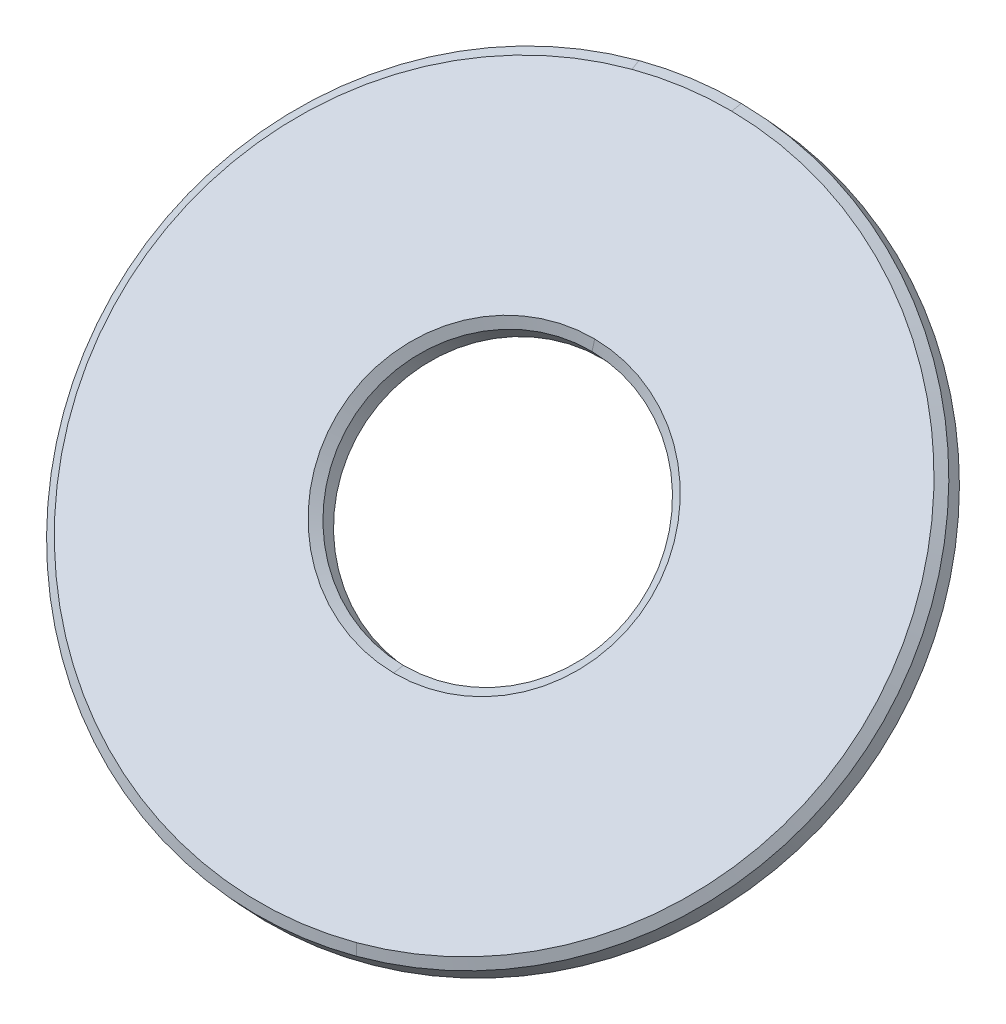
ISO-10303-21;
HEADER;
FILE_DESCRIPTION(('STEP AP214'),'2;1');
FILE_NAME('part.step','',(''),(''),'','','');
FILE_SCHEMA(('AUTOMOTIVE_DESIGN { 1 0 10303 214 1 1 1 1 }'));
ENDSEC;
DATA;
#1=APPLICATION_CONTEXT('core data for automotive mechanical design processes');
#2=APPLICATION_PROTOCOL_DEFINITION('international standard','automotive_design',2000,#1);
#3=PRODUCT_CONTEXT('',#1,'mechanical');
#4=PRODUCT('Part','Part','',(#3));
#5=PRODUCT_RELATED_PRODUCT_CATEGORY('part','',(#4));
#6=PRODUCT_DEFINITION_FORMATION('','',#4);
#7=PRODUCT_DEFINITION_CONTEXT('part definition',#1,'design');
#8=PRODUCT_DEFINITION('design','',#6,#7);
#9=PRODUCT_DEFINITION_SHAPE('','',#8);
#10=(LENGTH_UNIT() NAMED_UNIT(*) SI_UNIT(.MILLI.,.METRE.));
#11=(NAMED_UNIT(*) PLANE_ANGLE_UNIT() SI_UNIT($,.RADIAN.));
#12=(NAMED_UNIT(*) SI_UNIT($,.STERADIAN.) SOLID_ANGLE_UNIT());
#13=UNCERTAINTY_MEASURE_WITH_UNIT(LENGTH_MEASURE(1.E-05),#10,'distance_accuracy_value','');
#14=(GEOMETRIC_REPRESENTATION_CONTEXT(3) GLOBAL_UNCERTAINTY_ASSIGNED_CONTEXT((#13)) GLOBAL_UNIT_ASSIGNED_CONTEXT((#10,
#11,#12)) REPRESENTATION_CONTEXT('',''));
#15=CARTESIAN_POINT('',(0.,0.,0.));
#16=DIRECTION('',(0.,0.,1.));
#17=DIRECTION('',(1.,0.,0.));
#18=AXIS2_PLACEMENT_3D('',#15,#16,#17);
#19=CARTESIAN_POINT('',(-32.0413030325885,39.8953625177244,29.7265539162494));
#20=DIRECTION('',(0.241844762647997,0.707106781186508,0.664463024388709));
#21=DIRECTION('',(0.,-0.684791078771776,0.728739444818646));
#22=AXIS2_PLACEMENT_3D('',#19,#20,#21);
#23=CONICAL_SURFACE('',#22,1.64999999990241,0.785398163680828);
#24=CARTESIAN_POINT('',(-32.0654875088166,39.824651839713,29.6601076139113));
#25=DIRECTION('',(0.241844762648,0.707106781186508,0.664463024388708));
#26=DIRECTION('',(-0.970314954424455,0.176241818055159,0.165613135918863));
#27=AXIS2_PLACEMENT_3D('',#24,#25,#26);
#28=CIRCLE('',#27,1.55000000000785);
#29=CARTESIAN_POINT('',(-32.0654875088268,40.8860780118111,28.5305614744443));
#30=VERTEX_POINT('',#29);
#31=CARTESIAN_POINT('',(-32.0654875088268,38.7632256676185,30.789653753382));
#32=VERTEX_POINT('',#31);
#33=EDGE_CURVE('E41',#30,#32,#28,.T.);
#34=ORIENTED_EDGE('',*,*,#33,.F.);
#35=DIRECTION('',(0.171010071614389,0.984220415491074,-0.0454502930355773));
#36=VECTOR('',#35,1.);
#37=CARTESIAN_POINT('',(-32.0413030325885,41.025267797631,28.5241338323697));
#38=LINE('',#37,#36);
#39=CARTESIAN_POINT('',(-32.0413030325771,41.0252677976965,28.5241338323667));
#40=VERTEX_POINT('',#39);
#41=EDGE_CURVE('E11',#30,#40,#38,.T.);
#42=ORIENTED_EDGE('',*,*,#41,.T.);
#43=CARTESIAN_POINT('',(-32.0413030325771,39.8953625177577,29.7265539162806));
#44=DIRECTION('',(0.241844762647997,0.707106781186509,0.664463024388708));
#45=DIRECTION('',(0.,-0.684791078771774,0.728739444818647));
#46=AXIS2_PLACEMENT_3D('',#43,#44,#45);
#47=CIRCLE('',#46,1.64999999994945);
#48=CARTESIAN_POINT('',(-32.0413030325771,38.7654572378188,30.9289740001946));
#49=VERTEX_POINT('',#48);
#50=EDGE_CURVE('E27',#40,#49,#47,.T.);
#51=ORIENTED_EDGE('',*,*,#50,.T.);
#52=DIRECTION('',(0.171010071614389,0.0157795842254914,0.985142913555243));
#53=VECTOR('',#52,1.);
#54=CARTESIAN_POINT('',(-32.0413030325885,38.7654572378177,30.928974000129));
#55=LINE('',#54,#53);
#56=EDGE_CURVE('E184',#32,#49,#55,.T.);
#57=ORIENTED_EDGE('',*,*,#56,.F.);
#58=EDGE_LOOP('',(#34,#42,#51,#57));
#59=FACE_BOUND('',#58,.T.);
#60=ADVANCED_FACE('F16',(#59),#23,.F.);
#61=CARTESIAN_POINT('',(-32.065487508824,39.824651839706,29.6601076138962));
#62=DIRECTION('',(-0.241844762648002,-0.707106781186508,-0.664463024388707));
#63=DIRECTION('',(0.,0.684791078771774,-0.728739444818647));
#64=AXIS2_PLACEMENT_3D('',#61,#62,#63);
#65=CONICAL_SURFACE('',#64,3.999999999954,0.785398163348843);
#66=CARTESIAN_POINT('',(-32.0413030325854,39.8953625177482,29.7265539162631));
#67=DIRECTION('',(-0.241844762648002,-0.707106781186508,-0.664463024388707));
#68=DIRECTION('',(0.,0.684791078771774,-0.728739444818647));
#69=AXIS2_PLACEMENT_3D('',#66,#67,#68);
#70=CIRCLE('',#69,3.90000000007195);
#71=CARTESIAN_POINT('',(-32.9844976069057,42.6530789644455,27.1351481211396));
#72=VERTEX_POINT('',#71);
#73=CARTESIAN_POINT('',(-32.0413030325854,42.5660477250074,26.884470081418));
#74=VERTEX_POINT('',#73);
#75=EDGE_CURVE('E174',#72,#74,#70,.T.);
#76=ORIENTED_EDGE('',*,*,#75,.T.);
#77=DIRECTION('',(-0.171010071671165,-0.0157795845522379,-0.985142913540153));
#78=VECTOR('',#77,1.);
#79=CARTESIAN_POINT('',(-32.065487508824,42.5638161547616,26.7451498346551));
#80=LINE('',#79,#78);
#81=CARTESIAN_POINT('',(-32.0654875088268,42.5638161547936,26.7451498346221));
#82=VERTEX_POINT('',#81);
#83=EDGE_CURVE('E129',#74,#82,#80,.T.);
#84=ORIENTED_EDGE('',*,*,#83,.T.);
#85=CARTESIAN_POINT('',(-32.065487508824,39.824651839706,29.6601076138962));
#86=DIRECTION('',(0.241844762648003,0.707106781186508,0.664463024388707));
#87=DIRECTION('',(-0.970314954424454,0.176241818066685,0.165613135906601));
#88=AXIS2_PLACEMENT_3D('',#85,#86,#87);
#89=CIRCLE('',#88,3.999999999954);
#90=CARTESIAN_POINT('',(-33.0328665594211,42.6530789644179,27.0022555162742));
#91=VERTEX_POINT('',#90);
#92=EDGE_CURVE('E253',#82,#91,#89,.T.);
#93=ORIENTED_EDGE('',*,*,#92,.T.);
#94=DIRECTION('',(-0.342020143328698,0.,-0.939692620784806));
#95=VECTOR('',#94,1.);
#96=CARTESIAN_POINT('',(-199135.249068371,42.6530789106248,-547001.840916849));
#97=LINE('',#96,#95);
#98=EDGE_CURVE('E212',#72,#91,#97,.T.);
#99=ORIENTED_EDGE('',*,*,#98,.F.);
#100=EDGE_LOOP('',(#76,#84,#93,#99));
#101=FACE_BOUND('',#100,.T.);
#102=ADVANCED_FACE('F371',(#101),#65,.T.);
#103=CARTESIAN_POINT('',(-32.04130303257,39.89536251781,29.72655391633));
#104=DIRECTION('',(0.241844762648003,0.707106781186508,0.664463024388707));
#105=DIRECTION('',(0.,-0.684791078771775,0.728739444818647));
#106=AXIS2_PLACEMENT_3D('',#103,#104,#105);
#107=CYLINDRICAL_SURFACE('',#106,1.55);
#108=CARTESIAN_POINT('',(-32.1380409376286,39.6125198053373,29.4607687065764));
#109=DIRECTION('',(0.241844762648003,0.707106781186508,0.664463024388707));
#110=DIRECTION('',(0.,-0.684791078771775,0.728739444818647));
#111=AXIS2_PLACEMENT_3D('',#108,#109,#110);
#112=CIRCLE('',#111,1.55);
#113=CARTESIAN_POINT('',(-32.1380409376235,40.6739459774793,28.331222567057));
#114=VERTEX_POINT('',#113);
#115=CARTESIAN_POINT('',(-32.1380409376235,38.5510936331927,30.590314846095));
#116=VERTEX_POINT('',#115);
#117=EDGE_CURVE('E156',#114,#116,#112,.T.);
#118=ORIENTED_EDGE('',*,*,#117,.F.);
#119=DIRECTION('',(0.241844762648003,0.707106781186508,0.664463024388707));
#120=VECTOR('',#119,1.);
#121=CARTESIAN_POINT('',(-32.04130303257,40.9567886899063,28.5970077768611));
#122=LINE('',#121,#120);
#123=EDGE_CURVE('E492',#114,#30,#122,.T.);
#124=ORIENTED_EDGE('',*,*,#123,.T.);
#125=ORIENTED_EDGE('',*,*,#33,.T.);
#126=DIRECTION('',(0.241844762648003,0.707106781186508,0.664463024388707));
#127=VECTOR('',#126,1.);
#128=CARTESIAN_POINT('',(-32.04130303257,38.8339363457138,30.8561000557989));
#129=LINE('',#128,#127);
#130=EDGE_CURVE('E229',#116,#32,#129,.T.);
#131=ORIENTED_EDGE('',*,*,#130,.F.);
#132=EDGE_LOOP('',(#118,#124,#125,#131));
#133=FACE_BOUND('',#132,.T.);
#134=ADVANCED_FACE('F323',(#133),#107,.F.);
#135=CARTESIAN_POINT('',(-32.16222541389,39.54180912722,29.39432240413));
#136=DIRECTION('',(-0.241844762648003,-0.707106781186508,-0.664463024388707));
#137=DIRECTION('',(0.,0.684791078771774,-0.728739444818647));
#138=AXIS2_PLACEMENT_3D('',#135,#136,#137);
#139=CYLINDRICAL_SURFACE('',#138,4.);
#140=CARTESIAN_POINT('',(-32.065487508824,39.824651839706,29.6601076138962));
#141=DIRECTION('',(0.241844762648003,0.707106781186508,0.664463024388707));
#142=DIRECTION('',(-0.970314954424455,0.17624181806668,0.165613135906607));
#143=AXIS2_PLACEMENT_3D('',#140,#141,#142);
#144=CIRCLE('',#143,3.999999999954);
#145=CARTESIAN_POINT('',(-32.0654875088268,37.0854875246194,32.5750653931712));
#146=VERTEX_POINT('',#145);
#147=CARTESIAN_POINT('',(-31.0981084582342,36.996224714992,32.3179597114164));
#148=VERTEX_POINT('',#147);
#149=EDGE_CURVE('E20',#146,#148,#144,.T.);
#150=ORIENTED_EDGE('',*,*,#149,.F.);
#151=DIRECTION('',(-0.241844762648003,-0.707106781186508,-0.664463024388707));
#152=VECTOR('',#151,1.);
#153=CARTESIAN_POINT('',(-32.16222541389,36.8026448121329,32.3092801834046));
#154=LINE('',#153,#152);
#155=CARTESIAN_POINT('',(-32.1380409376211,36.8733554902664,32.3757264858254));
#156=VERTEX_POINT('',#155);
#157=EDGE_CURVE('E197',#146,#156,#154,.T.);
#158=ORIENTED_EDGE('',*,*,#157,.T.);
#159=CARTESIAN_POINT('',(-32.1380409376253,39.6125198053384,29.4607687065686));
#160=DIRECTION('',(0.241844762648003,0.707106781186508,0.664463024388707));
#161=DIRECTION('',(-1.04430353253804E-12,0.684791078771963,-0.728739444818469));
#162=AXIS2_PLACEMENT_3D('',#159,#160,#161);
#163=CIRCLE('',#162,4.);
#164=CARTESIAN_POINT('',(-32.1380409376211,42.35168412041,26.545810927309));
#165=VERTEX_POINT('',#164);
#166=EDGE_CURVE('E193',#156,#165,#163,.T.);
#167=ORIENTED_EDGE('',*,*,#166,.T.);
#168=DIRECTION('',(-0.241844762648003,-0.707106781186508,-0.664463024388707));
#169=VECTOR('',#168,1.);
#170=CARTESIAN_POINT('',(-32.16222541389,42.2809734423071,26.4793646248554));
#171=LINE('',#170,#169);
#172=EDGE_CURVE('E88',#82,#165,#171,.T.);
#173=ORIENTED_EDGE('',*,*,#172,.F.);
#174=CARTESIAN_POINT('',(-32.065487508824,39.824651839706,29.6601076138962));
#175=DIRECTION('',(0.241844762648003,0.707106781186508,0.664463024388707));
#176=DIRECTION('',(-0.970314954424455,0.176241818066678,0.165613135906608));
#177=AXIS2_PLACEMENT_3D('',#174,#175,#176);
#178=CIRCLE('',#177,3.999999999954);
#179=EDGE_CURVE('E227',#148,#82,#178,.T.);
#180=ORIENTED_EDGE('',*,*,#179,.F.);
#181=EDGE_LOOP('',(#150,#158,#167,#173,#180));
#182=FACE_BOUND('',#181,.T.);
#183=ADVANCED_FACE('F196',(#182),#139,.T.);
#184=CARTESIAN_POINT('',(-32.162225413883,39.5418091272327,29.3943224041515));
#185=DIRECTION('',(-0.241844762647999,-0.707106781186511,-0.664463024388705));
#186=DIRECTION('',(0.,0.684791078771772,-0.728739444818649));
#187=AXIS2_PLACEMENT_3D('',#184,#185,#186);
#188=CONICAL_SURFACE('',#187,1.6500000000391,0.785398163357481);
#189=ORIENTED_EDGE('',*,*,#117,.T.);
#190=DIRECTION('',(-0.171010071669686,-0.984220415496176,0.0454502927170357));
#191=VECTOR('',#190,1.);
#192=CARTESIAN_POINT('',(-32.162225413883,38.4119038472325,30.5967424881308));
#193=LINE('',#192,#191);
#194=CARTESIAN_POINT('',(-32.162225413883,38.4119038472325,30.5967424881308));
#195=VERTEX_POINT('',#194);
#196=EDGE_CURVE('E153',#116,#195,#193,.T.);
#197=ORIENTED_EDGE('',*,*,#196,.T.);
#198=CARTESIAN_POINT('',(-32.162225413883,39.5418091272327,29.3943224041515));
#199=DIRECTION('',(0.241844762647999,0.707106781186509,0.664463024388708));
#200=DIRECTION('',(0.,0.684791078771774,-0.728739444818647));
#201=AXIS2_PLACEMENT_3D('',#198,#199,#200);
#202=CIRCLE('',#201,1.65000000003911);
#203=CARTESIAN_POINT('',(-32.162225413883,40.6717144072329,28.1919023201722));
#204=VERTEX_POINT('',#203);
#205=EDGE_CURVE('E141',#204,#195,#202,.T.);
#206=ORIENTED_EDGE('',*,*,#205,.F.);
#207=DIRECTION('',(-0.171010071669686,-0.0157795845437398,-0.985142913540546));
#208=VECTOR('',#207,1.);
#209=CARTESIAN_POINT('',(-32.162225413883,40.6717144072329,28.1919023201722));
#210=LINE('',#209,#208);
#211=EDGE_CURVE('E163',#114,#204,#210,.T.);
#212=ORIENTED_EDGE('',*,*,#211,.F.);
#213=EDGE_LOOP('',(#189,#197,#206,#212));
#214=FACE_BOUND('',#213,.T.);
#215=ADVANCED_FACE('F154',(#214),#188,.F.);
#216=CARTESIAN_POINT('',(-32.1380409376204,39.6125198053403,29.4607687065692));
#217=DIRECTION('',(0.241844762648004,0.707106781186508,0.664463024388707));
#218=DIRECTION('',(0.,-0.684791078771774,0.728739444818647));
#219=AXIS2_PLACEMENT_3D('',#216,#217,#218);
#220=CONICAL_SURFACE('',#219,3.99999999998053,0.78539816333635);
#221=CARTESIAN_POINT('',(-32.162225413892,39.5418091272017,29.3943224041115));
#222=DIRECTION('',(0.241844762648004,0.707106781186508,0.664463024388707));
#223=DIRECTION('',(0.,-0.684791078771774,0.728739444818647));
#224=AXIS2_PLACEMENT_3D('',#221,#222,#223);
#225=CIRCLE('',#224,3.89999999996456);
#226=CARTESIAN_POINT('',(-32.162225413892,36.871123920016,32.2364062388784));
#227=VERTEX_POINT('',#226);
#228=CARTESIAN_POINT('',(-32.162225413892,42.2124943343873,26.5522385693446));
#229=VERTEX_POINT('',#228);
#230=EDGE_CURVE('E161',#227,#229,#225,.T.);
#231=ORIENTED_EDGE('',*,*,#230,.T.);
#232=DIRECTION('',(0.171010071673303,0.984220415496509,-0.0454502926962175));
#233=VECTOR('',#232,1.);
#234=CARTESIAN_POINT('',(-32.1380409376204,42.3516841204141,26.5458109273088));
#235=LINE('',#234,#233);
#236=EDGE_CURVE('E179',#229,#165,#235,.T.);
#237=ORIENTED_EDGE('',*,*,#236,.T.);
#238=ORIENTED_EDGE('',*,*,#166,.F.);
#239=DIRECTION('',(0.171010071673303,0.015779584564533,0.985142913539585));
#240=VECTOR('',#239,1.);
#241=CARTESIAN_POINT('',(-32.1380409376204,36.8733554902666,32.3757264858296));
#242=LINE('',#241,#240);
#243=EDGE_CURVE('E75',#227,#156,#242,.T.);
#244=ORIENTED_EDGE('',*,*,#243,.F.);
#245=EDGE_LOOP('',(#231,#237,#238,#244));
#246=FACE_BOUND('',#245,.T.);
#247=ADVANCED_FACE('F192',(#246),#220,.T.);
#248=CARTESIAN_POINT('',(-32.04130303257,39.89536251781,29.72655391633));
#249=DIRECTION('',(-0.241844762648003,-0.707106781186508,-0.664463024388707));
#250=DIRECTION('',(0.,0.684791078771774,-0.728739444818647));
#251=AXIS2_PLACEMENT_3D('',#248,#249,#250);
#252=PLANE('',#251);
#253=ORIENTED_EDGE('',*,*,#75,.F.);
#254=CARTESIAN_POINT('',(-32.0413030325602,39.8953625178219,29.7265539163324));
#255=DIRECTION('',(-0.241844762648002,-0.707106781186508,-0.664463024388707));
#256=DIRECTION('',(0.,0.684791078771774,-0.728739444818647));
#257=AXIS2_PLACEMENT_3D('',#254,#255,#256);
#258=CIRCLE('',#257,3.89999999996766);
#259=CARTESIAN_POINT('',(-31.0981084582377,37.137646071204,32.3179597113994));
#260=VERTEX_POINT('',#259);
#261=EDGE_CURVE('E221',#260,#72,#258,.T.);
#262=ORIENTED_EDGE('',*,*,#261,.F.);
#263=CARTESIAN_POINT('',(-32.0413030325854,39.8953625177482,29.7265539162631));
#264=DIRECTION('',(-0.241844762648002,-0.707106781186508,-0.664463024388707));
#265=DIRECTION('',(0.,0.684791078771774,-0.728739444818647));
#266=AXIS2_PLACEMENT_3D('',#263,#264,#265);
#267=CIRCLE('',#266,3.90000000007195);
#268=EDGE_CURVE('E223',#74,#260,#267,.T.);
#269=ORIENTED_EDGE('',*,*,#268,.F.);
#270=EDGE_LOOP('',(#253,#262,#269));
#271=FACE_BOUND('',#270,.T.);
#272=CARTESIAN_POINT('',(-32.0413030325771,39.8953625177577,29.7265539162806));
#273=DIRECTION('',(0.241844762647997,0.707106781186509,0.664463024388708));
#274=DIRECTION('',(0.,-0.684791078771774,0.728739444818647));
#275=AXIS2_PLACEMENT_3D('',#272,#273,#274);
#276=CIRCLE('',#275,1.64999999994945);
#277=EDGE_CURVE('E172',#49,#40,#276,.T.);
#278=ORIENTED_EDGE('',*,*,#277,.F.);
#279=ORIENTED_EDGE('',*,*,#50,.F.);
#280=EDGE_LOOP('',(#278,#279));
#281=FACE_BOUND('',#280,.T.);
#282=ADVANCED_FACE('F331',(#271,#281),#252,.F.);
#283=CARTESIAN_POINT('',(-32.0413030325885,39.8953625177244,29.7265539162494));
#284=DIRECTION('',(0.241844762647997,0.707106781186508,0.664463024388709));
#285=DIRECTION('',(0.,-0.684791078771776,0.728739444818646));
#286=AXIS2_PLACEMENT_3D('',#283,#284,#285);
#287=CONICAL_SURFACE('',#286,1.64999999990241,0.785398163680828);
#288=ORIENTED_EDGE('',*,*,#41,.F.);
#289=CARTESIAN_POINT('',(-32.0654875088166,39.824651839713,29.6601076139113));
#290=DIRECTION('',(0.241844762648,0.707106781186508,0.664463024388708));
#291=DIRECTION('',(-0.970314954424455,0.176241818055159,0.165613135918863));
#292=AXIS2_PLACEMENT_3D('',#289,#290,#291);
#293=CIRCLE('',#292,1.55000000000785);
#294=EDGE_CURVE('E235',#32,#30,#293,.T.);
#295=ORIENTED_EDGE('',*,*,#294,.F.);
#296=ORIENTED_EDGE('',*,*,#56,.T.);
#297=ORIENTED_EDGE('',*,*,#277,.T.);
#298=EDGE_LOOP('',(#288,#295,#296,#297));
#299=FACE_BOUND('',#298,.T.);
#300=ADVANCED_FACE('F359',(#299),#287,.F.);
#301=CARTESIAN_POINT('',(-32.0654875088401,39.824651839659,29.660107613852));
#302=DIRECTION('',(-0.241844762648002,-0.707106781186508,-0.664463024388707));
#303=DIRECTION('',(0.,0.684791078771774,-0.728739444818647));
#304=AXIS2_PLACEMENT_3D('',#301,#302,#303);
#305=CONICAL_SURFACE('',#304,4.0000000000546,0.785398163519446);
#306=DIRECTION('',(-1.49746881561441E-12,1.,7.63153429339525E-13));
#307=VECTOR('',#306,1.);
#308=CARTESIAN_POINT('',(-31.0981075865071,-582098.939583211,32.3179592671403));
#309=LINE('',#308,#307);
#310=EDGE_CURVE('E248',#148,#260,#309,.T.);
#311=ORIENTED_EDGE('',*,*,#310,.T.);
#312=ORIENTED_EDGE('',*,*,#261,.T.);
#313=ORIENTED_EDGE('',*,*,#98,.T.);
#314=CARTESIAN_POINT('',(-32.065487508824,39.824651839706,29.6601076138962));
#315=DIRECTION('',(0.241844762648003,0.707106781186508,0.664463024388707));
#316=DIRECTION('',(-0.970314954424455,0.176241818066678,0.165613135906608));
#317=AXIS2_PLACEMENT_3D('',#314,#315,#316);
#318=CIRCLE('',#317,3.999999999954);
#319=EDGE_CURVE('E204',#91,#146,#318,.T.);
#320=ORIENTED_EDGE('',*,*,#319,.T.);
#321=ORIENTED_EDGE('',*,*,#149,.T.);
#322=EDGE_LOOP('',(#311,#312,#313,#320,#321));
#323=FACE_BOUND('',#322,.T.);
#324=ADVANCED_FACE('F209',(#323),#305,.T.);
#325=CARTESIAN_POINT('',(-32.065487508824,39.824651839706,29.6601076138962));
#326=DIRECTION('',(-0.241844762648002,-0.707106781186508,-0.664463024388707));
#327=DIRECTION('',(0.,0.684791078771774,-0.728739444818647));
#328=AXIS2_PLACEMENT_3D('',#325,#326,#327);
#329=CONICAL_SURFACE('',#328,3.999999999954,0.785398163348843);
#330=ORIENTED_EDGE('',*,*,#83,.F.);
#331=ORIENTED_EDGE('',*,*,#268,.T.);
#332=ORIENTED_EDGE('',*,*,#310,.F.);
#333=ORIENTED_EDGE('',*,*,#179,.T.);
#334=EDGE_LOOP('',(#330,#331,#332,#333));
#335=FACE_BOUND('',#334,.T.);
#336=ADVANCED_FACE('F336',(#335),#329,.T.);
#337=CARTESIAN_POINT('',(-32.04130303257,39.89536251781,29.72655391633));
#338=DIRECTION('',(0.241844762648003,0.707106781186508,0.664463024388707));
#339=DIRECTION('',(0.,-0.684791078771775,0.728739444818647));
#340=AXIS2_PLACEMENT_3D('',#337,#338,#339);
#341=CYLINDRICAL_SURFACE('',#340,1.55);
#342=ORIENTED_EDGE('',*,*,#123,.F.);
#343=CARTESIAN_POINT('',(-32.1380409376286,39.6125198053373,29.4607687065764));
#344=DIRECTION('',(0.241844762648003,0.707106781186508,0.664463024388707));
#345=DIRECTION('',(0.,-0.684791078771775,0.728739444818647));
#346=AXIS2_PLACEMENT_3D('',#343,#344,#345);
#347=CIRCLE('',#346,1.55);
#348=EDGE_CURVE('E183',#116,#114,#347,.T.);
#349=ORIENTED_EDGE('',*,*,#348,.F.);
#350=ORIENTED_EDGE('',*,*,#130,.T.);
#351=ORIENTED_EDGE('',*,*,#294,.T.);
#352=EDGE_LOOP('',(#342,#349,#350,#351));
#353=FACE_BOUND('',#352,.T.);
#354=ADVANCED_FACE('F340',(#353),#341,.F.);
#355=CARTESIAN_POINT('',(-32.16222541389,39.54180912722,29.39432240413));
#356=DIRECTION('',(-0.241844762648003,-0.707106781186508,-0.664463024388707));
#357=DIRECTION('',(0.,0.684791078771774,-0.728739444818647));
#358=AXIS2_PLACEMENT_3D('',#355,#356,#357);
#359=CYLINDRICAL_SURFACE('',#358,4.);
#360=ORIENTED_EDGE('',*,*,#157,.F.);
#361=ORIENTED_EDGE('',*,*,#319,.F.);
#362=ORIENTED_EDGE('',*,*,#92,.F.);
#363=ORIENTED_EDGE('',*,*,#172,.T.);
#364=CARTESIAN_POINT('',(-32.1380409376253,39.6125198053384,29.4607687065686));
#365=DIRECTION('',(0.241844762648003,0.707106781186508,0.664463024388707));
#366=DIRECTION('',(0.,0.684791078771774,-0.728739444818647));
#367=AXIS2_PLACEMENT_3D('',#364,#365,#366);
#368=CIRCLE('',#367,4.);
#369=EDGE_CURVE('E180',#165,#156,#368,.T.);
#370=ORIENTED_EDGE('',*,*,#369,.T.);
#371=EDGE_LOOP('',(#360,#361,#362,#363,#370));
#372=FACE_BOUND('',#371,.T.);
#373=ADVANCED_FACE('F201',(#372),#359,.T.);
#374=CARTESIAN_POINT('',(-32.162225413883,39.5418091272327,29.3943224041515));
#375=DIRECTION('',(-0.241844762647999,-0.707106781186511,-0.664463024388705));
#376=DIRECTION('',(0.,0.684791078771772,-0.728739444818649));
#377=AXIS2_PLACEMENT_3D('',#374,#375,#376);
#378=CONICAL_SURFACE('',#377,1.6500000000391,0.785398163357481);
#379=ORIENTED_EDGE('',*,*,#196,.F.);
#380=ORIENTED_EDGE('',*,*,#348,.T.);
#381=ORIENTED_EDGE('',*,*,#211,.T.);
#382=CARTESIAN_POINT('',(-32.162225413883,39.5418091272327,29.3943224041515));
#383=DIRECTION('',(0.241844762647999,0.707106781186509,0.664463024388708));
#384=DIRECTION('',(0.,0.684791078771774,-0.728739444818647));
#385=AXIS2_PLACEMENT_3D('',#382,#383,#384);
#386=CIRCLE('',#385,1.65000000003911);
#387=EDGE_CURVE('E145',#195,#204,#386,.T.);
#388=ORIENTED_EDGE('',*,*,#387,.F.);
#389=EDGE_LOOP('',(#379,#380,#381,#388));
#390=FACE_BOUND('',#389,.T.);
#391=ADVANCED_FACE('F18',(#390),#378,.F.);
#392=CARTESIAN_POINT('',(-32.1380409376204,39.6125198053403,29.4607687065692));
#393=DIRECTION('',(0.241844762648004,0.707106781186508,0.664463024388707));
#394=DIRECTION('',(0.,-0.684791078771774,0.728739444818647));
#395=AXIS2_PLACEMENT_3D('',#392,#393,#394);
#396=CONICAL_SURFACE('',#395,3.99999999998053,0.78539816333635);
#397=ORIENTED_EDGE('',*,*,#236,.F.);
#398=CARTESIAN_POINT('',(-32.162225413892,39.5418091272017,29.3943224041115));
#399=DIRECTION('',(0.241844762648004,0.707106781186508,0.664463024388707));
#400=DIRECTION('',(0.,-0.684791078771774,0.728739444818647));
#401=AXIS2_PLACEMENT_3D('',#398,#399,#400);
#402=CIRCLE('',#401,3.89999999996456);
#403=EDGE_CURVE('E245',#229,#227,#402,.T.);
#404=ORIENTED_EDGE('',*,*,#403,.T.);
#405=ORIENTED_EDGE('',*,*,#243,.T.);
#406=ORIENTED_EDGE('',*,*,#369,.F.);
#407=EDGE_LOOP('',(#397,#404,#405,#406));
#408=FACE_BOUND('',#407,.T.);
#409=ADVANCED_FACE('F200',(#408),#396,.T.);
#410=CARTESIAN_POINT('',(-32.16222541389,39.54180912722,29.39432240413));
#411=DIRECTION('',(-0.241844762648003,-0.707106781186508,-0.664463024388707));
#412=DIRECTION('',(0.,0.684791078771774,-0.728739444818647));
#413=AXIS2_PLACEMENT_3D('',#410,#411,#412);
#414=PLANE('',#413);
#415=ORIENTED_EDGE('',*,*,#230,.F.);
#416=ORIENTED_EDGE('',*,*,#403,.F.);
#417=EDGE_LOOP('',(#415,#416));
#418=FACE_BOUND('',#417,.T.);
#419=ORIENTED_EDGE('',*,*,#205,.T.);
#420=ORIENTED_EDGE('',*,*,#387,.T.);
#421=EDGE_LOOP('',(#419,#420));
#422=FACE_BOUND('',#421,.T.);
#423=ADVANCED_FACE('F143',(#418,#422),#414,.T.);
#424=CLOSED_SHELL('',(#60,#102,#134,#183,#215,#247,#282,#300,#324,#336,#354,#373,#391,#409,#423));
#425=MANIFOLD_SOLID_BREP('B1',#424);
#426=ADVANCED_BREP_SHAPE_REPRESENTATION('',(#18,#425),#14);
#427=SHAPE_DEFINITION_REPRESENTATION(#9,#426);
ENDSEC;
END-ISO-10303-21;
